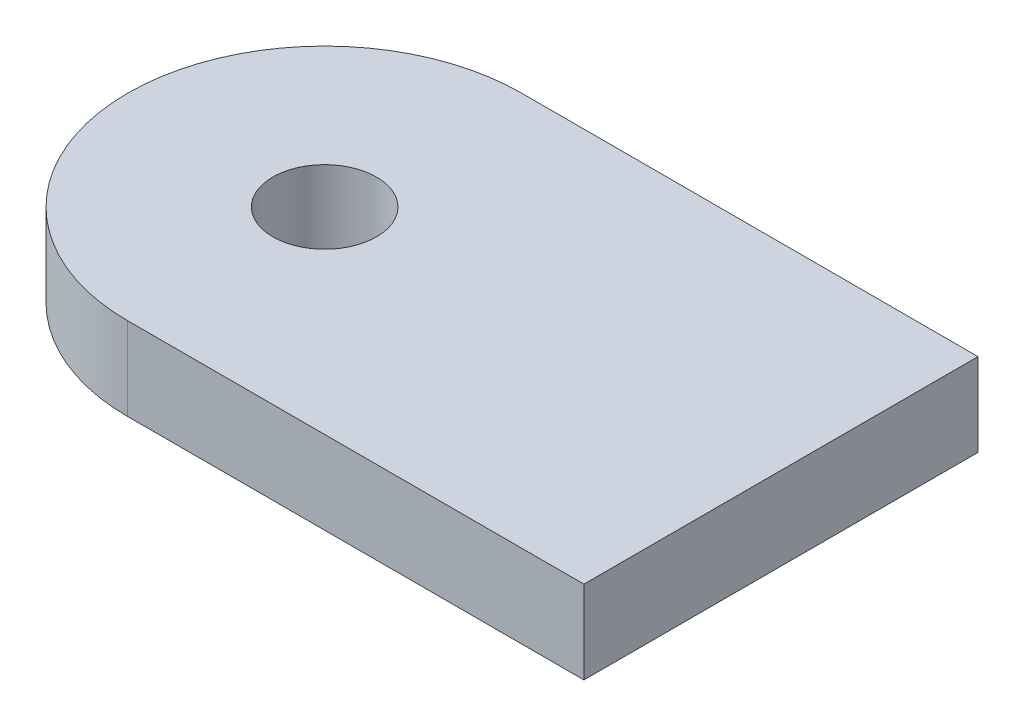
ISO-10303-21;
HEADER;
FILE_DESCRIPTION(('STEP AP214'),'2;1');
FILE_NAME('part.step','',(''),(''),'','','');
FILE_SCHEMA(('AUTOMOTIVE_DESIGN { 1 0 10303 214 1 1 1 1 }'));
ENDSEC;
DATA;
#1=APPLICATION_CONTEXT('core data for automotive mechanical design processes');
#2=APPLICATION_PROTOCOL_DEFINITION('international standard','automotive_design',2000,#1);
#3=PRODUCT_CONTEXT('',#1,'mechanical');
#4=PRODUCT('Part','Part','',(#3));
#5=PRODUCT_RELATED_PRODUCT_CATEGORY('part','',(#4));
#6=PRODUCT_DEFINITION_FORMATION('','',#4);
#7=PRODUCT_DEFINITION_CONTEXT('part definition',#1,'design');
#8=PRODUCT_DEFINITION('design','',#6,#7);
#9=PRODUCT_DEFINITION_SHAPE('','',#8);
#10=(LENGTH_UNIT() NAMED_UNIT(*) SI_UNIT(.MILLI.,.METRE.));
#11=(NAMED_UNIT(*) PLANE_ANGLE_UNIT() SI_UNIT($,.RADIAN.));
#12=(NAMED_UNIT(*) SI_UNIT($,.STERADIAN.) SOLID_ANGLE_UNIT());
#13=UNCERTAINTY_MEASURE_WITH_UNIT(LENGTH_MEASURE(1.E-05),#10,'distance_accuracy_value','');
#14=(GEOMETRIC_REPRESENTATION_CONTEXT(3) GLOBAL_UNCERTAINTY_ASSIGNED_CONTEXT((#13)) GLOBAL_UNIT_ASSIGNED_CONTEXT((#10,
#11,#12)) REPRESENTATION_CONTEXT('',''));
#15=CARTESIAN_POINT('',(0.,0.,0.));
#16=DIRECTION('',(0.,0.,1.));
#17=DIRECTION('',(1.,0.,0.));
#18=AXIS2_PLACEMENT_3D('',#15,#16,#17);
#19=CARTESIAN_POINT('',(0.,4.,-19.));
#20=DIRECTION('',(0.,0.,1.));
#21=DIRECTION('',(1.,0.,0.));
#22=AXIS2_PLACEMENT_3D('',#19,#20,#21);
#23=PLANE('',#22);
#24=DIRECTION('',(-1.,0.,0.));
#25=VECTOR('',#24,1.);
#26=CARTESIAN_POINT('',(0.,0.,-19.));
#27=LINE('',#26,#25);
#28=CARTESIAN_POINT('',(22.,0.,-19.));
#29=VERTEX_POINT('',#28);
#30=CARTESIAN_POINT('',(0.,0.,-19.));
#31=VERTEX_POINT('',#30);
#32=EDGE_CURVE('E105',#29,#31,#27,.T.);
#33=ORIENTED_EDGE('',*,*,#32,.T.);
#34=DIRECTION('',(0.,-1.,0.));
#35=VECTOR('',#34,1.);
#36=CARTESIAN_POINT('',(0.,4.,-19.));
#37=LINE('',#36,#35);
#38=CARTESIAN_POINT('',(0.,4.,-19.));
#39=VERTEX_POINT('',#38);
#40=EDGE_CURVE('E11',#39,#31,#37,.T.);
#41=ORIENTED_EDGE('',*,*,#40,.F.);
#42=DIRECTION('',(-1.,0.,0.));
#43=VECTOR('',#42,1.);
#44=CARTESIAN_POINT('',(0.,4.,-19.));
#45=LINE('',#44,#43);
#46=CARTESIAN_POINT('',(22.,4.,-19.));
#47=VERTEX_POINT('',#46);
#48=EDGE_CURVE('E79',#47,#39,#45,.T.);
#49=ORIENTED_EDGE('',*,*,#48,.F.);
#50=DIRECTION('',(0.,-1.,0.));
#51=VECTOR('',#50,1.);
#52=CARTESIAN_POINT('',(22.,4.,-19.));
#53=LINE('',#52,#51);
#54=EDGE_CURVE('E101',#47,#29,#53,.T.);
#55=ORIENTED_EDGE('',*,*,#54,.T.);
#56=EDGE_LOOP('',(#33,#41,#49,#55));
#57=FACE_BOUND('',#56,.T.);
#58=ADVANCED_FACE('F36',(#57),#23,.F.);
#59=CARTESIAN_POINT('',(0.,4.,-9.5));
#60=DIRECTION('',(0.,-1.,0.));
#61=DIRECTION('',(0.,0.,-1.));
#62=AXIS2_PLACEMENT_3D('',#59,#60,#61);
#63=CYLINDRICAL_SURFACE('',#62,9.5);
#64=CARTESIAN_POINT('',(0.,0.,-9.5));
#65=DIRECTION('',(0.,1.,0.));
#66=DIRECTION('',(0.,0.,1.));
#67=AXIS2_PLACEMENT_3D('',#64,#65,#66);
#68=CIRCLE('',#67,9.5);
#69=CARTESIAN_POINT('',(0.,0.,0.));
#70=VERTEX_POINT('',#69);
#71=EDGE_CURVE('E89',#70,#31,#68,.F.);
#72=ORIENTED_EDGE('',*,*,#71,.F.);
#73=DIRECTION('',(0.,-1.,0.));
#74=VECTOR('',#73,1.);
#75=CARTESIAN_POINT('',(0.,4.,0.));
#76=LINE('',#75,#74);
#77=CARTESIAN_POINT('',(0.,4.,0.));
#78=VERTEX_POINT('',#77);
#79=EDGE_CURVE('E45',#78,#70,#76,.T.);
#80=ORIENTED_EDGE('',*,*,#79,.F.);
#81=CARTESIAN_POINT('',(0.,4.,-9.5));
#82=DIRECTION('',(0.,1.,0.));
#83=DIRECTION('',(0.,0.,1.));
#84=AXIS2_PLACEMENT_3D('',#81,#82,#83);
#85=CIRCLE('',#84,9.5);
#86=EDGE_CURVE('E87',#78,#39,#85,.F.);
#87=ORIENTED_EDGE('',*,*,#86,.T.);
#88=ORIENTED_EDGE('',*,*,#40,.T.);
#89=EDGE_LOOP('',(#72,#80,#87,#88));
#90=FACE_BOUND('',#89,.T.);
#91=ADVANCED_FACE('F86',(#90),#63,.T.);
#92=CARTESIAN_POINT('',(0.,4.,0.));
#93=DIRECTION('',(0.,0.,-1.));
#94=DIRECTION('',(-1.,0.,0.));
#95=AXIS2_PLACEMENT_3D('',#92,#93,#94);
#96=PLANE('',#95);
#97=DIRECTION('',(1.,0.,0.));
#98=VECTOR('',#97,1.);
#99=CARTESIAN_POINT('',(0.,0.,0.));
#100=LINE('',#99,#98);
#101=CARTESIAN_POINT('',(22.,0.,0.));
#102=VERTEX_POINT('',#101);
#103=EDGE_CURVE('E68',#70,#102,#100,.T.);
#104=ORIENTED_EDGE('',*,*,#103,.T.);
#105=DIRECTION('',(0.,-1.,0.));
#106=VECTOR('',#105,1.);
#107=CARTESIAN_POINT('',(22.,4.,0.));
#108=LINE('',#107,#106);
#109=CARTESIAN_POINT('',(22.,4.,0.));
#110=VERTEX_POINT('',#109);
#111=EDGE_CURVE('E90',#110,#102,#108,.T.);
#112=ORIENTED_EDGE('',*,*,#111,.F.);
#113=DIRECTION('',(1.,0.,0.));
#114=VECTOR('',#113,1.);
#115=CARTESIAN_POINT('',(0.,4.,0.));
#116=LINE('',#115,#114);
#117=EDGE_CURVE('E91',#78,#110,#116,.T.);
#118=ORIENTED_EDGE('',*,*,#117,.F.);
#119=ORIENTED_EDGE('',*,*,#79,.T.);
#120=EDGE_LOOP('',(#104,#112,#118,#119));
#121=FACE_BOUND('',#120,.T.);
#122=ADVANCED_FACE('F92',(#121),#96,.F.);
#123=CARTESIAN_POINT('',(0.,4.,-9.5));
#124=DIRECTION('',(0.,-1.,0.));
#125=DIRECTION('',(0.,0.,-1.));
#126=AXIS2_PLACEMENT_3D('',#123,#124,#125);
#127=CYLINDRICAL_SURFACE('',#126,2.5);
#128=CARTESIAN_POINT('',(0.,4.,-9.5));
#129=DIRECTION('',(0.,1.,0.));
#130=DIRECTION('',(0.,0.,1.));
#131=AXIS2_PLACEMENT_3D('',#128,#129,#130);
#132=CIRCLE('',#131,2.5);
#133=CARTESIAN_POINT('',(0.,4.,-7.));
#134=VERTEX_POINT('',#133);
#135=EDGE_CURVE('E96',#134,#134,#132,.T.);
#136=ORIENTED_EDGE('',*,*,#135,.T.);
#137=EDGE_LOOP('',(#136));
#138=FACE_BOUND('',#137,.T.);
#139=CARTESIAN_POINT('',(0.,0.,-9.5));
#140=DIRECTION('',(0.,1.,0.));
#141=DIRECTION('',(0.,0.,1.));
#142=AXIS2_PLACEMENT_3D('',#139,#140,#141);
#143=CIRCLE('',#142,2.5);
#144=CARTESIAN_POINT('',(0.,0.,-7.));
#145=VERTEX_POINT('',#144);
#146=EDGE_CURVE('E102',#145,#145,#143,.T.);
#147=ORIENTED_EDGE('',*,*,#146,.F.);
#148=EDGE_LOOP('',(#147));
#149=FACE_BOUND('',#148,.T.);
#150=ADVANCED_FACE('F38',(#138,#149),#127,.F.);
#151=CARTESIAN_POINT('',(22.,4.,0.));
#152=DIRECTION('',(-1.,0.,0.));
#153=DIRECTION('',(0.,0.,1.));
#154=AXIS2_PLACEMENT_3D('',#151,#152,#153);
#155=PLANE('',#154);
#156=DIRECTION('',(0.,0.,-1.));
#157=VECTOR('',#156,1.);
#158=CARTESIAN_POINT('',(22.,0.,0.));
#159=LINE('',#158,#157);
#160=EDGE_CURVE('E74',#102,#29,#159,.T.);
#161=ORIENTED_EDGE('',*,*,#160,.T.);
#162=ORIENTED_EDGE('',*,*,#54,.F.);
#163=DIRECTION('',(0.,0.,-1.));
#164=VECTOR('',#163,1.);
#165=CARTESIAN_POINT('',(22.,4.,0.));
#166=LINE('',#165,#164);
#167=EDGE_CURVE('E53',#110,#47,#166,.T.);
#168=ORIENTED_EDGE('',*,*,#167,.F.);
#169=ORIENTED_EDGE('',*,*,#111,.T.);
#170=EDGE_LOOP('',(#161,#162,#168,#169));
#171=FACE_BOUND('',#170,.T.);
#172=ADVANCED_FACE('F112',(#171),#155,.F.);
#173=CARTESIAN_POINT('',(0.,4.,0.));
#174=DIRECTION('',(0.,1.,0.));
#175=DIRECTION('',(0.,0.,1.));
#176=AXIS2_PLACEMENT_3D('',#173,#174,#175);
#177=PLANE('',#176);
#178=ORIENTED_EDGE('',*,*,#135,.F.);
#179=EDGE_LOOP('',(#178));
#180=FACE_BOUND('',#179,.T.);
#181=ORIENTED_EDGE('',*,*,#48,.T.);
#182=ORIENTED_EDGE('',*,*,#86,.F.);
#183=ORIENTED_EDGE('',*,*,#117,.T.);
#184=ORIENTED_EDGE('',*,*,#167,.T.);
#185=EDGE_LOOP('',(#181,#182,#183,#184));
#186=FACE_BOUND('',#185,.T.);
#187=ADVANCED_FACE('F94',(#180,#186),#177,.T.);
#188=CARTESIAN_POINT('',(0.,0.,0.));
#189=DIRECTION('',(0.,1.,0.));
#190=DIRECTION('',(0.,0.,1.));
#191=AXIS2_PLACEMENT_3D('',#188,#189,#190);
#192=PLANE('',#191);
#193=ORIENTED_EDGE('',*,*,#146,.T.);
#194=EDGE_LOOP('',(#193));
#195=FACE_BOUND('',#194,.T.);
#196=ORIENTED_EDGE('',*,*,#32,.F.);
#197=ORIENTED_EDGE('',*,*,#160,.F.);
#198=ORIENTED_EDGE('',*,*,#103,.F.);
#199=ORIENTED_EDGE('',*,*,#71,.T.);
#200=EDGE_LOOP('',(#196,#197,#198,#199));
#201=FACE_BOUND('',#200,.T.);
#202=ADVANCED_FACE('F115',(#195,#201),#192,.F.);
#203=CLOSED_SHELL('',(#58,#91,#122,#150,#172,#187,#202));
#204=MANIFOLD_SOLID_BREP('B2',#203);
#205=ADVANCED_BREP_SHAPE_REPRESENTATION('',(#18,#204),#14);
#206=SHAPE_DEFINITION_REPRESENTATION(#9,#205);
ENDSEC;
END-ISO-10303-21;
